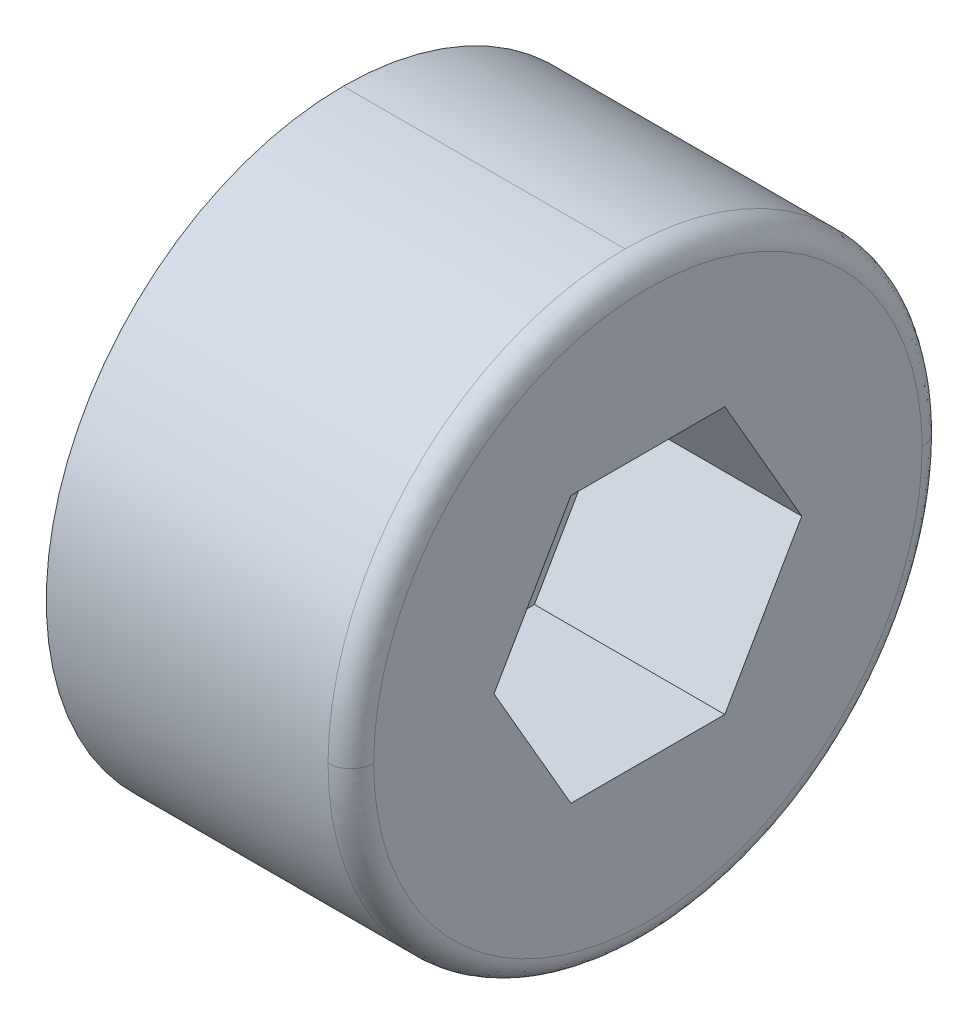
ISO-10303-21;
HEADER;
FILE_DESCRIPTION(('STEP AP214'),'2;1');
FILE_NAME('part.step','',(''),(''),'','','');
FILE_SCHEMA(('AUTOMOTIVE_DESIGN { 1 0 10303 214 1 1 1 1 }'));
ENDSEC;
DATA;
#1=APPLICATION_CONTEXT('core data for automotive mechanical design processes');
#2=APPLICATION_PROTOCOL_DEFINITION('international standard','automotive_design',2000,#1);
#3=PRODUCT_CONTEXT('',#1,'mechanical');
#4=PRODUCT('Part','Part','',(#3));
#5=PRODUCT_RELATED_PRODUCT_CATEGORY('part','',(#4));
#6=PRODUCT_DEFINITION_FORMATION('','',#4);
#7=PRODUCT_DEFINITION_CONTEXT('part definition',#1,'design');
#8=PRODUCT_DEFINITION('design','',#6,#7);
#9=PRODUCT_DEFINITION_SHAPE('','',#8);
#10=(LENGTH_UNIT() NAMED_UNIT(*) SI_UNIT(.MILLI.,.METRE.));
#11=(NAMED_UNIT(*) PLANE_ANGLE_UNIT() SI_UNIT($,.RADIAN.));
#12=(NAMED_UNIT(*) SI_UNIT($,.STERADIAN.) SOLID_ANGLE_UNIT());
#13=UNCERTAINTY_MEASURE_WITH_UNIT(LENGTH_MEASURE(1.E-05),#10,'distance_accuracy_value','');
#14=(GEOMETRIC_REPRESENTATION_CONTEXT(3) GLOBAL_UNCERTAINTY_ASSIGNED_CONTEXT((#13)) GLOBAL_UNIT_ASSIGNED_CONTEXT((#10,
#11,#12)) REPRESENTATION_CONTEXT('',''));
#15=CARTESIAN_POINT('',(0.,0.,0.));
#16=DIRECTION('',(0.,0.,1.));
#17=DIRECTION('',(1.,0.,0.));
#18=AXIS2_PLACEMENT_3D('',#15,#16,#17);
#19=CARTESIAN_POINT('',(1.5,-1.75,2.020725942));
#20=DIRECTION('',(1.,0.,0.));
#21=DIRECTION('',(0.,1.,0.));
#22=AXIS2_PLACEMENT_3D('',#19,#20,#21);
#23=PLANE('',#22);
#24=DIRECTION('',(0.,-0.866025403801977,-0.499999999969623));
#25=VECTOR('',#24,1.);
#26=CARTESIAN_POINT('',(1.5,-0.875,1.5155444565));
#27=LINE('',#26,#25);
#28=CARTESIAN_POINT('',(1.5,9.78279848622143E-10,2.02072594143519));
#29=VERTEX_POINT('',#28);
#30=CARTESIAN_POINT('',(1.5,-1.75,1.010362971));
#31=VERTEX_POINT('',#30);
#32=EDGE_CURVE('E201',#29,#31,#27,.T.);
#33=ORIENTED_EDGE('',*,*,#32,.T.);
#34=DIRECTION('',(0.,0.,-1.));
#35=VECTOR('',#34,1.);
#36=CARTESIAN_POINT('',(1.5,-1.75,0.));
#37=LINE('',#36,#35);
#38=CARTESIAN_POINT('',(1.5,-1.75,-1.010362971));
#39=VERTEX_POINT('',#38);
#40=EDGE_CURVE('E27',#31,#39,#37,.T.);
#41=ORIENTED_EDGE('',*,*,#40,.T.);
#42=DIRECTION('',(0.,0.866025403801977,-0.499999999969623));
#43=VECTOR('',#42,1.);
#44=CARTESIAN_POINT('',(1.5,-0.875,-1.5155444565));
#45=LINE('',#44,#43);
#46=CARTESIAN_POINT('',(1.5,-4.89139924311072E-10,-2.02072594171759));
#47=VERTEX_POINT('',#46);
#48=EDGE_CURVE('E11',#39,#47,#45,.T.);
#49=ORIENTED_EDGE('',*,*,#48,.T.);
#50=DIRECTION('',(0.,0.866025403801977,0.499999999969623));
#51=VECTOR('',#50,1.);
#52=CARTESIAN_POINT('',(1.5,0.875,-1.5155444565));
#53=LINE('',#52,#51);
#54=CARTESIAN_POINT('',(1.5,1.75,-1.010362971));
#55=VERTEX_POINT('',#54);
#56=EDGE_CURVE('E136',#47,#55,#53,.T.);
#57=ORIENTED_EDGE('',*,*,#56,.T.);
#58=DIRECTION('',(0.,0.,1.));
#59=VECTOR('',#58,1.);
#60=CARTESIAN_POINT('',(1.5,1.75,0.));
#61=LINE('',#60,#59);
#62=CARTESIAN_POINT('',(1.5,1.75,1.010362971));
#63=VERTEX_POINT('',#62);
#64=EDGE_CURVE('E168',#55,#63,#61,.T.);
#65=ORIENTED_EDGE('',*,*,#64,.T.);
#66=DIRECTION('',(0.,-0.866025403801977,0.499999999969623));
#67=VECTOR('',#66,1.);
#68=CARTESIAN_POINT('',(1.5,0.875,1.5155444565));
#69=LINE('',#68,#67);
#70=EDGE_CURVE('E184',#63,#29,#69,.T.);
#71=ORIENTED_EDGE('',*,*,#70,.T.);
#72=EDGE_LOOP('',(#33,#41,#49,#57,#65,#71));
#73=FACE_BOUND('',#72,.T.);
#74=ADVANCED_FACE('F16',(#73),#23,.T.);
#75=CARTESIAN_POINT('',(0.,-3.9468,3.9468));
#76=DIRECTION('',(1.,0.,0.));
#77=DIRECTION('',(0.,1.,0.));
#78=AXIS2_PLACEMENT_3D('',#75,#76,#77);
#79=PLANE('',#78);
#80=CARTESIAN_POINT('',(0.,0.,0.));
#81=DIRECTION('',(-1.,0.,0.));
#82=DIRECTION('',(0.,-1.,0.));
#83=AXIS2_PLACEMENT_3D('',#80,#81,#82);
#84=CIRCLE('',#83,3.9);
#85=CARTESIAN_POINT('',(0.,-3.9,0.));
#86=VERTEX_POINT('',#85);
#87=CARTESIAN_POINT('',(0.,3.9,0.));
#88=VERTEX_POINT('',#87);
#89=EDGE_CURVE('E193',#86,#88,#84,.T.);
#90=ORIENTED_EDGE('',*,*,#89,.T.);
#91=CARTESIAN_POINT('',(0.,0.,0.));
#92=DIRECTION('',(-1.,0.,0.));
#93=DIRECTION('',(0.,-1.,0.));
#94=AXIS2_PLACEMENT_3D('',#91,#92,#93);
#95=CIRCLE('',#94,3.9);
#96=EDGE_CURVE('E182',#88,#86,#95,.T.);
#97=ORIENTED_EDGE('',*,*,#96,.T.);
#98=EDGE_LOOP('',(#90,#97));
#99=FACE_BOUND('',#98,.T.);
#100=ADVANCED_FACE('F301',(#99),#79,.F.);
#101=CARTESIAN_POINT('',(3.99850125,0.,3.570049975));
#102=CARTESIAN_POINT('',(3.99850125,-7.14009995,3.570049975));
#103=CARTESIAN_POINT('',(3.99850125,-7.14009995,-3.570049975));
#104=CARTESIAN_POINT('',(3.99850125,0.,-3.570049975));
#105=CARTESIAN_POINT('',(4.018966127,0.,3.77401613));
#106=CARTESIAN_POINT('',(4.018966127,-7.54803225899999,3.77401613));
#107=CARTESIAN_POINT('',(4.018966127,-7.54803225899999,-3.77401613));
#108=CARTESIAN_POINT('',(4.018966127,0.,-3.77401613));
#109=CARTESIAN_POINT('',(3.87401613,0.,3.918966127));
#110=CARTESIAN_POINT('',(3.87401613,-7.837932254,3.918966127));
#111=CARTESIAN_POINT('',(3.87401613,-7.837932254,-3.918966127));
#112=CARTESIAN_POINT('',(3.87401613,0.,-3.918966127));
#113=CARTESIAN_POINT('',(3.670049975,0.,3.89850125));
#114=CARTESIAN_POINT('',(3.670049975,-7.79700249900001,3.89850125));
#115=CARTESIAN_POINT('',(3.670049975,-7.79700249900001,-3.89850125));
#116=CARTESIAN_POINT('',(3.670049975,0.,-3.89850125));
#117=(BOUNDED_SURFACE() B_SPLINE_SURFACE(3,3,((#101,#102,#103,#104),(#105,#106,#107,#108),(#109,
#110,#111,#112),(#113,#114,#115,#116)),.UNSPECIFIED.,.F.,.F.,
.F.) B_SPLINE_SURFACE_WITH_KNOTS((4,4),(4,4),(0.,1.),(0.,1.),
.UNSPECIFIED.) GEOMETRIC_REPRESENTATION_ITEM() RATIONAL_B_SPLINE_SURFACE(((1.,0.333333333333333,
0.333333333333333,1.),(0.755320871117972,0.251773623705991,0.251773623705991,0.755320871117972),
(0.755320871117972,0.251773623705991,0.251773623705991,0.755320871117972),(1.,0.333333333333333,
0.333333333333333,1.))) REPRESENTATION_ITEM('') SURFACE());
#118=CARTESIAN_POINT('',(3.70000000015646,-9.49885253349962E-10,-3.9000000002894));
#119=CARTESIAN_POINT('',(3.87573593167247,0.,-3.90000000014417));
#120=CARTESIAN_POINT('',(4.00000000014417,0.,-3.77573593167248));
#121=CARTESIAN_POINT('',(4.00000000023152,0.,-3.59999999941456));
#122=(BOUNDED_CURVE() B_SPLINE_CURVE(3,(#118,#119,#120,#121),.UNSPECIFIED.,.F.,
.F.) B_SPLINE_CURVE_WITH_KNOTS((4,4),(0.0631414570000006,0.936858542999998),
.UNSPECIFIED.) CURVE() GEOMETRIC_REPRESENTATION_ITEM() RATIONAL_B_SPLINE_CURVE((0.956578302165993,
0.769794770395975,0.769794770395974,0.956578302165992)) REPRESENTATION_ITEM(''));
#123=CARTESIAN_POINT('',(3.70000000015647,-9.49885253349962E-10,-3.9000000002894));
#124=VERTEX_POINT('',#123);
#125=CARTESIAN_POINT('',(4.00000000023152,0.,-3.59999999941456));
#126=VERTEX_POINT('',#125);
#127=EDGE_CURVE('E263',#124,#126,#122,.T.);
#128=CARTESIAN_POINT('',(4.00000000023152,0.,3.59999999941456));
#129=CARTESIAN_POINT('',(4.,-0.171341463422117,3.60000000022572));
#130=CARTESIAN_POINT('',(4.,-0.425847560994302,3.58200000022459));
#131=CARTESIAN_POINT('',(4.,-0.718385670763453,3.5295000002213));
#132=CARTESIAN_POINT('',(4.,-0.863558307965097,3.49537500021916));
#133=CARTESIAN_POINT('',(4.,-0.935870522145185,3.47634375021796));
#134=CARTESIAN_POINT('',(4.,-0.966802734417924,3.46776562521743));
#135=CARTESIAN_POINT('',(4.,-0.987411156674951,3.46195312521707));
#136=CARTESIAN_POINT('',(4.,-0.99576447757798,3.45956680635135));
#137=CARTESIAN_POINT('',(4.,-1.10588417977922,3.42746555113941));
#138=CARTESIAN_POINT('',(4.,-1.25048832581917,3.37855909635219));
#139=CARTESIAN_POINT('',(4.,-1.41530444663278,3.31081819871735));
#140=CARTESIAN_POINT('',(4.,-1.49674032798134,3.27427690813749));
#141=CARTESIAN_POINT('',(4.,-1.53143309590395,3.25804403179703));
#142=CARTESIAN_POINT('',(4.,-1.5545153136115,3.24709493129565));
#143=CARTESIAN_POINT('',(4.,-1.56470529080218,3.24220395225962));
#144=CARTESIAN_POINT('',(4.,-1.68011048320212,3.18596388936706));
#145=CARTESIAN_POINT('',(4.,-1.82985626690268,3.1039761320801));
#146=CARTESIAN_POINT('',(4.,-1.9973360204295,2.99607198674241));
#147=CARTESIAN_POINT('',(4.,-2.07926998199527,2.93905697361451));
#148=CARTESIAN_POINT('',(4.,-2.11399755512397,2.91396562360419));
#149=CARTESIAN_POINT('',(4.,-2.13706327458131,2.89709220262307));
#150=CARTESIAN_POINT('',(4.,-2.14738448891631,2.8894587868287));
#151=CARTESIAN_POINT('',(4.,-2.26092408953324,2.80432970699559));
#152=CARTESIAN_POINT('',(4.,-2.40565825250467,2.68346739806172));
#153=CARTESIAN_POINT('',(4.,-2.56287382639852,2.52958684994857));
#154=CARTESIAN_POINT('',(4.,-2.63857137595222,2.44942794563608));
#155=CARTESIAN_POINT('',(4.,-2.67038956060527,2.41438442301875));
#156=CARTESIAN_POINT('',(4.,-2.69146310097429,2.39086880649977));
#157=CARTESIAN_POINT('',(4.,-2.70106916169279,2.3800211146962));
#158=CARTESIAN_POINT('',(4.,-2.80240561165186,2.26394067280722));
#159=CARTESIAN_POINT('',(4.,-2.9279809725995,2.10242800646608));
#160=CARTESIAN_POINT('',(4.,-3.05779072545891,1.90220376071202));
#161=CARTESIAN_POINT('',(4.,-3.10984601206018,1.81386634074113));
#162=CARTESIAN_POINT('',(4.,-3.14375454432234,1.75441316544199));
#163=CARTESIAN_POINT('',(4.,-3.15937445666171,1.72616179690815));
#164=CARTESIAN_POINT('',(4.,-3.2448551152353,1.56594104819263));
#165=CARTESIAN_POINT('',(4.,-3.33523853300563,1.36881312384386));
#166=CARTESIAN_POINT('',(4.,-3.40733189199899,1.16439066065988));
#167=CARTESIAN_POINT('',(4.,-3.45132967382188,1.02648800990718));
#168=CARTESIAN_POINT('',(4.,-3.47078070315166,0.958755205130455));
#169=CARTESIAN_POINT('',(4.,-3.56303103432231,0.595748410525216));
#170=CARTESIAN_POINT('',(4.,-3.59995422240877,0.299636190966608));
#171=CARTESIAN_POINT('',(4.,-3.60002288903554,-0.149818095483304));
#172=CARTESIAN_POINT('',(4.,-3.58619390184546,-0.372950897871958));
#173=CARTESIAN_POINT('',(4.,-3.54579927257597,-0.630482404195193));
#174=CARTESIAN_POINT('',(4.,-3.52328854341454,-0.74025517194868));
#175=CARTESIAN_POINT('',(4.,-3.50712611393164,-0.813304155381313));
#176=CARTESIAN_POINT('',(4.,-3.49816566285691,-0.850950507488373));
#177=CARTESIAN_POINT('',(4.,-3.45349119550136,-1.02696720109354));
#178=CARTESIAN_POINT('',(4.,-3.38759149246185,-1.2335726923761));
#179=CARTESIAN_POINT('',(4.,-3.28920040670996,-1.46653698537937));
#180=CARTESIAN_POINT('',(4.,-3.24242392020077,-1.56464837234654));
#181=CARTESIAN_POINT('',(4.,-3.2102154006769,-1.62967141857102));
#182=CARTESIAN_POINT('',(4.,-3.19258022971688,-1.66390160637438));
#183=CARTESIAN_POINT('',(4.,-3.11203202301461,-1.81498181032773));
#184=CARTESIAN_POINT('',(4.,-3.00568537135167,-1.98975563778157));
#185=CARTESIAN_POINT('',(4.,-2.86465887140952,-2.18224420621988));
#186=CARTESIAN_POINT('',(4.,-2.78990676985461,-2.27563493287459));
#187=CARTESIAN_POINT('',(4.,-2.75696182956311,-2.31504805339136));
#188=CARTESIAN_POINT('',(4.,-2.73479668596002,-2.34118758337567));
#189=CARTESIAN_POINT('',(4.,-2.72269482173199,-2.35524201293053));
#190=CARTESIAN_POINT('',(4.,-2.6294003313383,-2.46217348693266));
#191=CARTESIAN_POINT('',(4.,-2.49816290851571,-2.59757072531252));
#192=CARTESIAN_POINT('',(4.,-2.33307423620171,-2.74297256458217));
#193=CARTESIAN_POINT('',(4.,-2.24753531362281,-2.81253308284028));
#194=CARTESIAN_POINT('',(4.,-2.2102340782843,-2.84167179037017));
#195=CARTESIAN_POINT('',(4.,-2.1852239887052,-2.8609480524674));
#196=CARTESIAN_POINT('',(4.,-2.17141028034126,-2.87143971429454));
#197=CARTESIAN_POINT('',(4.,-2.06871775813364,-2.94848228726893));
#198=CARTESIAN_POINT('',(4.,-1.92744708789462,-3.04433838461046));
#199=CARTESIAN_POINT('',(4.,-1.7550235181819,-3.14415266491632));
#200=CARTESIAN_POINT('',(4.,-1.66690978638375,-3.19105534675443));
#201=CARTESIAN_POINT('',(4.,-1.6287391984113,-3.2105126836176));
#202=CARTESIAN_POINT('',(4.,-1.60320157086101,-3.2233411720828));
#203=CARTESIAN_POINT('',(4.,-1.58898330897707,-3.23036865441294));
#204=CARTESIAN_POINT('',(4.,-1.48588633780302,-3.28064627214049));
#205=CARTESIAN_POINT('',(4.,-1.34596401244787,-3.34167030193811));
#206=CARTESIAN_POINT('',(4.,-1.17841682956813,-3.40234261415022));
#207=CARTESIAN_POINT('',(4.,-1.09356712063691,-3.43004817295166));
#208=CARTESIAN_POINT('',(4.,-1.05697236306109,-3.44135828444415));
#209=CARTESIAN_POINT('',(4.,-1.03252461432049,-3.44877309223416));
#210=CARTESIAN_POINT('',(4.,-1.01828027422652,-3.45300000021651));
#211=CARTESIAN_POINT('',(4.,-0.679031226229219,-3.55200000022271));
#212=CARTESIAN_POINT('',(4.,-0.343031226214295,-3.60000000022572));
#213=CARTESIAN_POINT('',(4.00000000023152,0.,-3.59999999941456));
#214=(BOUNDED_CURVE() B_SPLINE_CURVE(3,(#128,#129,#130,#131,#132,#133,#134,#135,#136,#137,#138,
#139,#140,#141,#142,#143,#144,#145,#146,#147,#148,#149,#150,#151,#152,#153,#154,#155,#156,#157,
#158,#159,#160,#161,#162,#163,#164,#165,#166,#167,#168,#169,#170,#171,#172,#173,#174,#175,#176,
#177,#178,#179,#180,#181,#182,#183,#184,#185,#186,#187,#188,#189,#190,#191,#192,#193,#194,#195,
#196,#197,#198,#199,#200,#201,#202,#203,#204,#205,#206,#207,#208,#209,#210,#211,#212,#213),
.UNSPECIFIED.,.F.,.F.) B_SPLINE_CURVE_WITH_KNOTS((4,1,1,1,1,2,2,1,1,1,2,2,1,1,1,2,2,1,1,1,2,2,1,
1,2,2,1,2,2,2,1,1,2,2,1,1,2,2,1,1,1,2,2,1,1,1,2,2,1,1,1,2,2,1,1,1,2,2,4),(0.,0.0624999999999983,
0.0937499999999975,0.109374999999997,0.117187499999997,0.121093749999997,0.124999999999997,
0.156249999999996,0.171874999999996,0.179687499999996,0.183593749999996,0.187499999999996,
0.218749999999995,0.234374999999995,0.242187499999995,0.246093749999995,0.249999999999995,
0.281249999999995,0.296874999999994,0.304687499999994,0.308593749999994,0.312499999999994,
0.343749999999994,0.359374999999994,0.367187499999994,0.374999999999994,0.406249999999994,
0.421874999999994,0.437499999999994,0.499999999999994,0.531249999999994,0.546874999999994,
0.5546875,0.5625,0.593749999999993,0.609374999999993,0.617187499999993,0.624999999999993,
0.65625,0.671875,0.6796875,0.683593749999993,0.6875,0.71875,0.734375,0.7421875,
0.746093749999993,0.75,0.78125,0.796875,0.8046875,0.808593749999995,0.8125,0.84375,0.859375,
0.8671875,0.871093749999997,0.875,1.),
.UNSPECIFIED.) CURVE() GEOMETRIC_REPRESENTATION_ITEM() RATIONAL_B_SPLINE_CURVE((1.,1.,1.,1.,1.,
1.,1.,1.,1.,1.,1.,1.,1.,1.,1.,1.,1.,1.,1.,1.,1.,1.,1.,1.,1.,1.,1.,1.,1.,1.,1.,1.,1.,1.,1.,1.,1.,
1.,1.,1.,1.,1.,1.,1.,1.,1.,1.,1.,1.,1.,1.,1.,1.,1.,1.,1.,1.,1.,1.,1.,1.,1.,1.,1.,1.,1.,1.,1.,1.,
1.,1.,1.,1.,1.,1.,1.,1.,1.,1.,1.,1.,1.,1.,1.,1.,1.)) REPRESENTATION_ITEM(''));
#215=CARTESIAN_POINT('',(4.00000000023152,0.,3.59999999941456));
#216=VERTEX_POINT('',#215);
#217=EDGE_CURVE('E162',#216,#126,#214,.T.);
#218=CARTESIAN_POINT('',(4.00000000023153,0.,3.59999999941456));
#219=CARTESIAN_POINT('',(4.00000000014416,0.,3.77573593167247));
#220=CARTESIAN_POINT('',(3.87573593167247,0.,3.90000000014416));
#221=CARTESIAN_POINT('',(3.7000000001685,0.,3.9000000002894));
#222=(BOUNDED_CURVE() B_SPLINE_CURVE(3,(#218,#219,#220,#221),.UNSPECIFIED.,.F.,
.F.) B_SPLINE_CURVE_WITH_KNOTS((4,4),(0.0631414570000008,0.936858543000001),
.UNSPECIFIED.) CURVE() GEOMETRIC_REPRESENTATION_ITEM() RATIONAL_B_SPLINE_CURVE((0.956578302165992,
0.769794770395974,0.769794770395975,0.956578302165994)) REPRESENTATION_ITEM(''));
#223=CARTESIAN_POINT('',(3.7000000001685,0.,3.9000000002894));
#224=VERTEX_POINT('',#223);
#225=EDGE_CURVE('E99',#216,#224,#222,.T.);
#226=CARTESIAN_POINT('',(3.70000000019257,0.,0.));
#227=DIRECTION('',(1.,0.,0.));
#228=DIRECTION('',(0.,0.,-1.));
#229=AXIS2_PLACEMENT_3D('',#226,#227,#228);
#230=CIRCLE('',#229,3.90000000038587);
#231=CARTESIAN_POINT('',(3.70000000019257,-3.9,0.));
#232=VERTEX_POINT('',#231);
#233=EDGE_CURVE('E223',#224,#232,#230,.T.);
#234=CARTESIAN_POINT('',(3.70000000019257,0.,0.));
#235=DIRECTION('',(1.,0.,0.));
#236=DIRECTION('',(0.,0.,-1.));
#237=AXIS2_PLACEMENT_3D('',#234,#235,#236);
#238=CIRCLE('',#237,3.90000000038587);
#239=EDGE_CURVE('E176',#232,#124,#238,.T.);
#240=ORIENTED_EDGE('',*,*,#127,.T.);
#241=ORIENTED_EDGE('',*,*,#217,.F.);
#242=ORIENTED_EDGE('',*,*,#225,.T.);
#243=ORIENTED_EDGE('',*,*,#233,.T.);
#244=ORIENTED_EDGE('',*,*,#239,.T.);
#245=EDGE_LOOP('',(#240,#241,#242,#243,#244));
#246=FACE_BOUND('',#245,.T.);
#247=ADVANCED_FACE('F290',(#246),#117,.T.);
#248=CARTESIAN_POINT('',(1.5,-1.75,-1.010362971));
#249=DIRECTION('',(0.,-0.499999999969623,-0.866025403801977));
#250=DIRECTION('',(0.,-0.866025403801977,0.499999999969623));
#251=AXIS2_PLACEMENT_3D('',#248,#249,#250);
#252=PLANE('',#251);
#253=DIRECTION('',(-1.,0.,0.));
#254=VECTOR('',#253,1.);
#255=CARTESIAN_POINT('',(2.75,0.,-2.020725942));
#256=LINE('',#255,#254);
#257=CARTESIAN_POINT('',(4.,3.48141971268104E-10,-2.020725944211));
#258=VERTEX_POINT('',#257);
#259=EDGE_CURVE('E128',#258,#47,#256,.T.);
#260=ORIENTED_EDGE('',*,*,#259,.T.);
#261=ORIENTED_EDGE('',*,*,#48,.F.);
#262=DIRECTION('',(1.,0.,0.));
#263=VECTOR('',#262,1.);
#264=CARTESIAN_POINT('',(2.75,-1.75,-1.010362971));
#265=LINE('',#264,#263);
#266=CARTESIAN_POINT('',(4.,-1.7500000007152,-1.010362971804));
#267=VERTEX_POINT('',#266);
#268=EDGE_CURVE('E144',#39,#267,#265,.T.);
#269=ORIENTED_EDGE('',*,*,#268,.T.);
#270=DIRECTION('',(0.,-0.866025403575383,0.500000000362095));
#271=VECTOR('',#270,1.);
#272=CARTESIAN_POINT('',(4.,0.,-2.020725945216));
#273=LINE('',#272,#271);
#274=EDGE_CURVE('E141',#258,#267,#273,.T.);
#275=ORIENTED_EDGE('',*,*,#274,.F.);
#276=EDGE_LOOP('',(#260,#261,#269,#275));
#277=FACE_BOUND('',#276,.T.);
#278=ADVANCED_FACE('F142',(#277),#252,.F.);
#279=CARTESIAN_POINT('',(1.5,-1.75,1.010362971));
#280=DIRECTION('',(0.,-1.,0.));
#281=DIRECTION('',(0.,0.,-1.));
#282=AXIS2_PLACEMENT_3D('',#279,#280,#281);
#283=PLANE('',#282);
#284=ORIENTED_EDGE('',*,*,#268,.F.);
#285=ORIENTED_EDGE('',*,*,#40,.F.);
#286=DIRECTION('',(1.,0.,0.));
#287=VECTOR('',#286,1.);
#288=CARTESIAN_POINT('',(2.75,-1.75,1.010362971));
#289=LINE('',#288,#287);
#290=CARTESIAN_POINT('',(4.,-1.7500000007152,1.010362971804));
#291=VERTEX_POINT('',#290);
#292=EDGE_CURVE('E188',#31,#291,#289,.T.);
#293=ORIENTED_EDGE('',*,*,#292,.T.);
#294=DIRECTION('',(0.,0.,1.));
#295=VECTOR('',#294,1.);
#296=CARTESIAN_POINT('',(4.,-1.7500000009536,0.));
#297=LINE('',#296,#295);
#298=EDGE_CURVE('E149',#267,#291,#297,.T.);
#299=ORIENTED_EDGE('',*,*,#298,.F.);
#300=EDGE_LOOP('',(#284,#285,#293,#299));
#301=FACE_BOUND('',#300,.T.);
#302=ADVANCED_FACE('F232',(#301),#283,.F.);
#303=CARTESIAN_POINT('',(1.5,0.,2.020725942));
#304=DIRECTION('',(0.,-0.499999999969623,0.866025403801977));
#305=DIRECTION('',(-1.,0.,0.));
#306=AXIS2_PLACEMENT_3D('',#303,#304,#305);
#307=PLANE('',#306);
#308=ORIENTED_EDGE('',*,*,#292,.F.);
#309=ORIENTED_EDGE('',*,*,#32,.F.);
#310=DIRECTION('',(1.,0.,0.));
#311=VECTOR('',#310,1.);
#312=CARTESIAN_POINT('',(2.75,0.,2.020725942));
#313=LINE('',#312,#311);
#314=CARTESIAN_POINT('',(4.,3.48141973353852E-10,2.020725944211));
#315=VERTEX_POINT('',#314);
#316=EDGE_CURVE('E166',#29,#315,#313,.T.);
#317=ORIENTED_EDGE('',*,*,#316,.T.);
#318=DIRECTION('',(0.,0.866025403575383,0.500000000362096));
#319=VECTOR('',#318,1.);
#320=CARTESIAN_POINT('',(4.,-1.7500000009536,1.010362972608));
#321=LINE('',#320,#319);
#322=EDGE_CURVE('E197',#291,#315,#321,.T.);
#323=ORIENTED_EDGE('',*,*,#322,.F.);
#324=EDGE_LOOP('',(#308,#309,#317,#323));
#325=FACE_BOUND('',#324,.T.);
#326=ADVANCED_FACE('F236',(#325),#307,.F.);
#327=CARTESIAN_POINT('',(1.5,1.75,1.010362971));
#328=DIRECTION('',(0.,0.499999999969623,0.866025403801977));
#329=DIRECTION('',(1.,0.,0.));
#330=AXIS2_PLACEMENT_3D('',#327,#328,#329);
#331=PLANE('',#330);
#332=ORIENTED_EDGE('',*,*,#316,.F.);
#333=ORIENTED_EDGE('',*,*,#70,.F.);
#334=DIRECTION('',(1.,0.,0.));
#335=VECTOR('',#334,1.);
#336=CARTESIAN_POINT('',(2.75,1.75,1.010362971));
#337=LINE('',#336,#335);
#338=CARTESIAN_POINT('',(4.,1.7500000007152,1.010362971804));
#339=VERTEX_POINT('',#338);
#340=EDGE_CURVE('E138',#63,#339,#337,.T.);
#341=ORIENTED_EDGE('',*,*,#340,.T.);
#342=DIRECTION('',(0.,0.866025403575383,-0.500000000362096));
#343=VECTOR('',#342,1.);
#344=CARTESIAN_POINT('',(4.,0.,2.020725945216));
#345=LINE('',#344,#343);
#346=EDGE_CURVE('E183',#315,#339,#345,.T.);
#347=ORIENTED_EDGE('',*,*,#346,.F.);
#348=EDGE_LOOP('',(#332,#333,#341,#347));
#349=FACE_BOUND('',#348,.T.);
#350=ADVANCED_FACE('F242',(#349),#331,.F.);
#351=CARTESIAN_POINT('',(1.5,1.75,-1.010362971));
#352=DIRECTION('',(0.,1.,0.));
#353=DIRECTION('',(1.,0.,0.));
#354=AXIS2_PLACEMENT_3D('',#351,#352,#353);
#355=PLANE('',#354);
#356=ORIENTED_EDGE('',*,*,#340,.F.);
#357=ORIENTED_EDGE('',*,*,#64,.F.);
#358=DIRECTION('',(1.,0.,0.));
#359=VECTOR('',#358,1.);
#360=CARTESIAN_POINT('',(2.75,1.75,-1.010362971));
#361=LINE('',#360,#359);
#362=CARTESIAN_POINT('',(4.,1.7500000007152,-1.010362971804));
#363=VERTEX_POINT('',#362);
#364=EDGE_CURVE('E204',#55,#363,#361,.T.);
#365=ORIENTED_EDGE('',*,*,#364,.T.);
#366=DIRECTION('',(0.,0.,-1.));
#367=VECTOR('',#366,1.);
#368=CARTESIAN_POINT('',(4.,1.7500000009536,0.));
#369=LINE('',#368,#367);
#370=EDGE_CURVE('E155',#339,#363,#369,.T.);
#371=ORIENTED_EDGE('',*,*,#370,.F.);
#372=EDGE_LOOP('',(#356,#357,#365,#371));
#373=FACE_BOUND('',#372,.T.);
#374=ADVANCED_FACE('F245',(#373),#355,.F.);
#375=CARTESIAN_POINT('',(1.5,0.,-2.020725942));
#376=DIRECTION('',(0.,0.499999999969623,-0.866025403801977));
#377=DIRECTION('',(-1.,0.,0.));
#378=AXIS2_PLACEMENT_3D('',#375,#376,#377);
#379=PLANE('',#378);
#380=ORIENTED_EDGE('',*,*,#364,.F.);
#381=ORIENTED_EDGE('',*,*,#56,.F.);
#382=ORIENTED_EDGE('',*,*,#259,.F.);
#383=DIRECTION('',(0.,-0.866025403575383,-0.500000000362095));
#384=VECTOR('',#383,1.);
#385=CARTESIAN_POINT('',(4.,1.7500000009536,-1.010362972608));
#386=LINE('',#385,#384);
#387=EDGE_CURVE('E133',#363,#258,#386,.T.);
#388=ORIENTED_EDGE('',*,*,#387,.F.);
#389=EDGE_LOOP('',(#380,#381,#382,#388));
#390=FACE_BOUND('',#389,.T.);
#391=ADVANCED_FACE('F131',(#390),#379,.F.);
#392=CARTESIAN_POINT('',(3.7,0.,0.));
#393=DIRECTION('',(-1.,0.,0.));
#394=DIRECTION('',(0.,-1.,0.));
#395=AXIS2_PLACEMENT_3D('',#392,#393,#394);
#396=CYLINDRICAL_SURFACE('',#395,3.9);
#397=DIRECTION('',(-1.,0.,0.));
#398=VECTOR('',#397,1.);
#399=CARTESIAN_POINT('',(3.7,3.9,0.));
#400=LINE('',#399,#398);
#401=CARTESIAN_POINT('',(3.70000000019257,3.9,0.));
#402=VERTEX_POINT('',#401);
#403=EDGE_CURVE('E189',#402,#88,#400,.T.);
#404=ORIENTED_EDGE('',*,*,#403,.F.);
#405=CARTESIAN_POINT('',(3.70000000019257,0.,0.));
#406=DIRECTION('',(1.,0.,0.));
#407=DIRECTION('',(0.,0.,-1.));
#408=AXIS2_PLACEMENT_3D('',#405,#406,#407);
#409=CIRCLE('',#408,3.90000000038587);
#410=EDGE_CURVE('E20',#124,#402,#409,.T.);
#411=ORIENTED_EDGE('',*,*,#410,.F.);
#412=ORIENTED_EDGE('',*,*,#239,.F.);
#413=DIRECTION('',(-1.,0.,0.));
#414=VECTOR('',#413,1.);
#415=CARTESIAN_POINT('',(3.7,-3.9,0.));
#416=LINE('',#415,#414);
#417=EDGE_CURVE('E219',#232,#86,#416,.T.);
#418=ORIENTED_EDGE('',*,*,#417,.T.);
#419=ORIENTED_EDGE('',*,*,#96,.F.);
#420=EDGE_LOOP('',(#404,#411,#412,#418,#419));
#421=FACE_BOUND('',#420,.T.);
#422=ADVANCED_FACE('F18',(#421),#396,.T.);
#423=CARTESIAN_POINT('',(4.,-3.6432,3.6432));
#424=DIRECTION('',(1.,0.,0.));
#425=DIRECTION('',(0.,1.,0.));
#426=AXIS2_PLACEMENT_3D('',#423,#424,#425);
#427=PLANE('',#426);
#428=ORIENTED_EDGE('',*,*,#370,.T.);
#429=ORIENTED_EDGE('',*,*,#387,.T.);
#430=ORIENTED_EDGE('',*,*,#274,.T.);
#431=ORIENTED_EDGE('',*,*,#298,.T.);
#432=ORIENTED_EDGE('',*,*,#322,.T.);
#433=ORIENTED_EDGE('',*,*,#346,.T.);
#434=EDGE_LOOP('',(#428,#429,#430,#431,#432,#433));
#435=FACE_BOUND('',#434,.T.);
#436=CARTESIAN_POINT('',(4.00000000023152,0.,3.59999999941456));
#437=CARTESIAN_POINT('',(4.00000000038587,7.2000000003199,3.60000000022572));
#438=CARTESIAN_POINT('',(4.00000000038587,7.2000000003199,-3.60000000022572));
#439=CARTESIAN_POINT('',(4.00000000023152,0.,-3.59999999941456));
#440=(BOUNDED_CURVE() B_SPLINE_CURVE(3,(#436,#437,#438,#439),.UNSPECIFIED.,.F.,
.F.) B_SPLINE_CURVE_WITH_KNOTS((4,4),(0.,1.),
.UNSPECIFIED.) CURVE() GEOMETRIC_REPRESENTATION_ITEM() RATIONAL_B_SPLINE_CURVE((0.95657830212221,
0.318859434040737,0.318859434040737,0.95657830212221)) REPRESENTATION_ITEM(''));
#441=EDGE_CURVE('E257',#216,#126,#440,.T.);
#442=ORIENTED_EDGE('',*,*,#441,.F.);
#443=ORIENTED_EDGE('',*,*,#217,.T.);
#444=EDGE_LOOP('',(#442,#443));
#445=FACE_BOUND('',#444,.T.);
#446=ADVANCED_FACE('F151',(#435,#445),#427,.T.);
#447=CARTESIAN_POINT('',(3.99850125,0.,-3.570049975));
#448=CARTESIAN_POINT('',(3.99850125,7.14009995,-3.570049975));
#449=CARTESIAN_POINT('',(3.99850125,7.14009995,3.570049975));
#450=CARTESIAN_POINT('',(3.99850125,0.,3.570049975));
#451=CARTESIAN_POINT('',(4.018966127,0.,-3.77401613));
#452=CARTESIAN_POINT('',(4.018966127,7.54803225899999,-3.77401613));
#453=CARTESIAN_POINT('',(4.018966127,7.54803225899999,3.77401613));
#454=CARTESIAN_POINT('',(4.018966127,0.,3.77401613));
#455=CARTESIAN_POINT('',(3.87401613,0.,-3.918966127));
#456=CARTESIAN_POINT('',(3.87401613,7.837932254,-3.918966127));
#457=CARTESIAN_POINT('',(3.87401613,7.837932254,3.918966127));
#458=CARTESIAN_POINT('',(3.87401613,0.,3.918966127));
#459=CARTESIAN_POINT('',(3.670049975,0.,-3.89850125));
#460=CARTESIAN_POINT('',(3.670049975,7.79700249900001,-3.89850125));
#461=CARTESIAN_POINT('',(3.670049975,7.79700249900001,3.89850125));
#462=CARTESIAN_POINT('',(3.670049975,0.,3.89850125));
#463=(BOUNDED_SURFACE() B_SPLINE_SURFACE(3,3,((#447,#448,#449,#450),(#451,#452,#453,#454),(#455,
#456,#457,#458),(#459,#460,#461,#462)),.UNSPECIFIED.,.F.,.F.,
.F.) B_SPLINE_SURFACE_WITH_KNOTS((4,4),(4,4),(0.,1.),(0.,1.),
.UNSPECIFIED.) GEOMETRIC_REPRESENTATION_ITEM() RATIONAL_B_SPLINE_SURFACE(((1.,0.333333333333333,
0.333333333333333,1.),(0.755320871117972,0.251773623705991,0.251773623705991,0.755320871117972),
(0.755320871117972,0.251773623705991,0.251773623705991,0.755320871117972),(1.,0.333333333333333,
0.333333333333333,1.))) REPRESENTATION_ITEM('') SURFACE());
#464=CARTESIAN_POINT('',(3.70000000019257,0.,0.));
#465=DIRECTION('',(1.,0.,0.));
#466=DIRECTION('',(0.,0.,-1.));
#467=AXIS2_PLACEMENT_3D('',#464,#465,#466);
#468=CIRCLE('',#467,3.90000000038587);
#469=EDGE_CURVE('E194',#402,#224,#468,.T.);
#470=ORIENTED_EDGE('',*,*,#441,.T.);
#471=ORIENTED_EDGE('',*,*,#127,.F.);
#472=ORIENTED_EDGE('',*,*,#410,.T.);
#473=ORIENTED_EDGE('',*,*,#469,.T.);
#474=ORIENTED_EDGE('',*,*,#225,.F.);
#475=EDGE_LOOP('',(#470,#471,#472,#473,#474));
#476=FACE_BOUND('',#475,.T.);
#477=ADVANCED_FACE('F285',(#476),#463,.T.);
#478=CARTESIAN_POINT('',(3.7,0.,0.));
#479=DIRECTION('',(-1.,0.,0.));
#480=DIRECTION('',(0.,-1.,0.));
#481=AXIS2_PLACEMENT_3D('',#478,#479,#480);
#482=CYLINDRICAL_SURFACE('',#481,3.9);
#483=ORIENTED_EDGE('',*,*,#469,.F.);
#484=ORIENTED_EDGE('',*,*,#403,.T.);
#485=ORIENTED_EDGE('',*,*,#89,.F.);
#486=ORIENTED_EDGE('',*,*,#417,.F.);
#487=ORIENTED_EDGE('',*,*,#233,.F.);
#488=EDGE_LOOP('',(#483,#484,#485,#486,#487));
#489=FACE_BOUND('',#488,.T.);
#490=ADVANCED_FACE('F287',(#489),#482,.T.);
#491=CLOSED_SHELL('',(#74,#100,#247,#278,#302,#326,#350,#374,#391,#422,#446,#477,#490));
#492=MANIFOLD_SOLID_BREP('B1',#491);
#493=ADVANCED_BREP_SHAPE_REPRESENTATION('',(#18,#492),#14);
#494=SHAPE_DEFINITION_REPRESENTATION(#9,#493);
ENDSEC;
END-ISO-10303-21;
